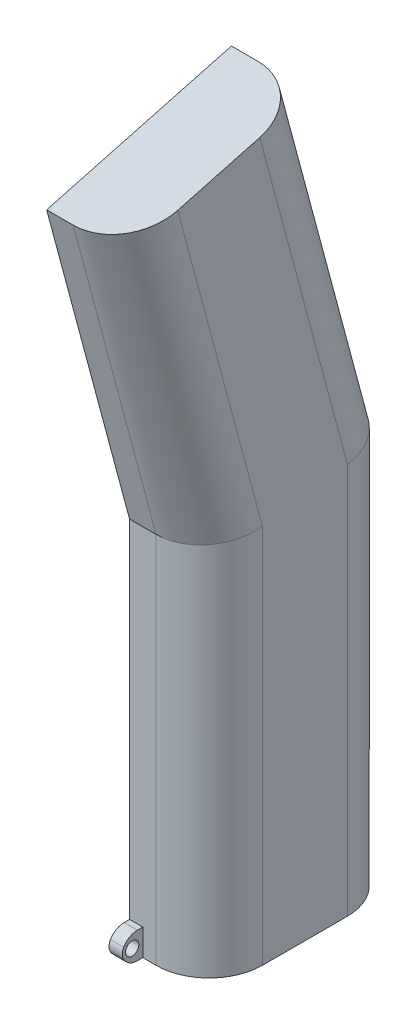
ISO-10303-21;
HEADER;
FILE_DESCRIPTION(('STEP AP214'),'2;1');
FILE_NAME('part.step','',(''),(''),'','','');
FILE_SCHEMA(('AUTOMOTIVE_DESIGN { 1 0 10303 214 1 1 1 1 }'));
ENDSEC;
DATA;
#1=APPLICATION_CONTEXT('core data for automotive mechanical design processes');
#2=APPLICATION_PROTOCOL_DEFINITION('international standard','automotive_design',2000,#1);
#3=PRODUCT_CONTEXT('',#1,'mechanical');
#4=PRODUCT('Part','Part','',(#3));
#5=PRODUCT_RELATED_PRODUCT_CATEGORY('part','',(#4));
#6=PRODUCT_DEFINITION_FORMATION('','',#4);
#7=PRODUCT_DEFINITION_CONTEXT('part definition',#1,'design');
#8=PRODUCT_DEFINITION('design','',#6,#7);
#9=PRODUCT_DEFINITION_SHAPE('','',#8);
#10=(LENGTH_UNIT() NAMED_UNIT(*) SI_UNIT(.MILLI.,.METRE.));
#11=(NAMED_UNIT(*) PLANE_ANGLE_UNIT() SI_UNIT($,.RADIAN.));
#12=(NAMED_UNIT(*) SI_UNIT($,.STERADIAN.) SOLID_ANGLE_UNIT());
#13=UNCERTAINTY_MEASURE_WITH_UNIT(LENGTH_MEASURE(1.E-05),#10,'distance_accuracy_value','');
#14=(GEOMETRIC_REPRESENTATION_CONTEXT(3) GLOBAL_UNCERTAINTY_ASSIGNED_CONTEXT((#13)) GLOBAL_UNIT_ASSIGNED_CONTEXT((#10,
#11,#12)) REPRESENTATION_CONTEXT('',''));
#15=CARTESIAN_POINT('',(0.,0.,0.));
#16=DIRECTION('',(0.,0.,1.));
#17=DIRECTION('',(1.,0.,0.));
#18=AXIS2_PLACEMENT_3D('',#15,#16,#17);
#19=CARTESIAN_POINT('',(15.,0.,18.));
#20=DIRECTION('',(0.,0.,-1.));
#21=DIRECTION('',(-1.,0.,0.));
#22=AXIS2_PLACEMENT_3D('',#19,#20,#21);
#23=PLANE('',#22);
#24=DIRECTION('',(0.,1.,0.));
#25=VECTOR('',#24,1.);
#26=CARTESIAN_POINT('',(2.5,0.,18.));
#27=LINE('',#26,#25);
#28=CARTESIAN_POINT('',(2.5,0.,18.));
#29=VERTEX_POINT('',#28);
#30=CARTESIAN_POINT('',(2.5,5.,18.));
#31=VERTEX_POINT('',#30);
#32=EDGE_CURVE('E234',#29,#31,#27,.T.);
#33=ORIENTED_EDGE('',*,*,#32,.F.);
#34=DIRECTION('',(-1.,0.,0.));
#35=VECTOR('',#34,1.);
#36=CARTESIAN_POINT('',(15.,0.,18.));
#37=LINE('',#36,#35);
#38=CARTESIAN_POINT('',(5.,0.,18.));
#39=VERTEX_POINT('',#38);
#40=EDGE_CURVE('E247',#39,#29,#37,.T.);
#41=ORIENTED_EDGE('',*,*,#40,.F.);
#42=DIRECTION('',(0.,-1.,0.));
#43=VECTOR('',#42,1.);
#44=CARTESIAN_POINT('',(5.,0.,18.));
#45=LINE('',#44,#43);
#46=CARTESIAN_POINT('',(5.,70.2605100868536,18.));
#47=VERTEX_POINT('',#46);
#48=EDGE_CURVE('E278',#39,#47,#45,.F.);
#49=ORIENTED_EDGE('',*,*,#48,.T.);
#50=DIRECTION('',(-1.,0.,0.));
#51=VECTOR('',#50,1.);
#52=CARTESIAN_POINT('',(15.,70.2605100868536,18.));
#53=LINE('',#52,#51);
#54=CARTESIAN_POINT('',(0.,70.2605100868536,18.));
#55=VERTEX_POINT('',#54);
#56=EDGE_CURVE('E453',#47,#55,#53,.T.);
#57=ORIENTED_EDGE('',*,*,#56,.T.);
#58=DIRECTION('',(0.,-1.,0.));
#59=VECTOR('',#58,1.);
#60=CARTESIAN_POINT('',(0.,0.,18.));
#61=LINE('',#60,#59);
#62=CARTESIAN_POINT('',(0.,5.,18.));
#63=VERTEX_POINT('',#62);
#64=EDGE_CURVE('E294',#55,#63,#61,.T.);
#65=ORIENTED_EDGE('',*,*,#64,.T.);
#66=DIRECTION('',(-1.,0.,0.));
#67=VECTOR('',#66,1.);
#68=CARTESIAN_POINT('',(0.,5.,18.));
#69=LINE('',#68,#67);
#70=EDGE_CURVE('E251',#31,#63,#69,.T.);
#71=ORIENTED_EDGE('',*,*,#70,.F.);
#72=EDGE_LOOP('',(#33,#41,#49,#57,#65,#71));
#73=FACE_BOUND('',#72,.T.);
#74=ADVANCED_FACE('F33',(#73),#23,.F.);
#75=CARTESIAN_POINT('',(0.,0.,0.));
#76=DIRECTION('',(-1.,0.,0.));
#77=DIRECTION('',(0.,0.,1.));
#78=AXIS2_PLACEMENT_3D('',#75,#76,#77);
#79=PLANE('',#78);
#80=CARTESIAN_POINT('',(0.,2.5,-20.));
#81=DIRECTION('',(-1.,0.,0.));
#82=DIRECTION('',(0.,0.,1.));
#83=AXIS2_PLACEMENT_3D('',#80,#81,#82);
#84=CIRCLE('',#83,1.25);
#85=CARTESIAN_POINT('',(0.,2.5,-18.75));
#86=VERTEX_POINT('',#85);
#87=EDGE_CURVE('E622',#86,#86,#84,.T.);
#88=ORIENTED_EDGE('',*,*,#87,.F.);
#89=EDGE_LOOP('',(#88));
#90=FACE_BOUND('',#89,.T.);
#91=CARTESIAN_POINT('',(0.,2.5,20.));
#92=DIRECTION('',(-1.,0.,0.));
#93=DIRECTION('',(0.,0.,1.));
#94=AXIS2_PLACEMENT_3D('',#91,#92,#93);
#95=CIRCLE('',#94,1.25);
#96=CARTESIAN_POINT('',(0.,2.5,21.25));
#97=VERTEX_POINT('',#96);
#98=EDGE_CURVE('E358',#97,#97,#95,.F.);
#99=ORIENTED_EDGE('',*,*,#98,.T.);
#100=EDGE_LOOP('',(#99));
#101=FACE_BOUND('',#100,.T.);
#102=CARTESIAN_POINT('',(0.,2.,-19.));
#103=DIRECTION('',(-1.,0.,0.));
#104=DIRECTION('',(0.,0.,1.));
#105=AXIS2_PLACEMENT_3D('',#102,#103,#104);
#106=CIRCLE('',#105,3.);
#107=CARTESIAN_POINT('',(0.,5.,-19.));
#108=VERTEX_POINT('',#107);
#109=CARTESIAN_POINT('',(0.,3.50000000000001,-21.5980762113533));
#110=VERTEX_POINT('',#109);
#111=EDGE_CURVE('E326',#108,#110,#106,.T.);
#112=ORIENTED_EDGE('',*,*,#111,.T.);
#113=CARTESIAN_POINT('',(0.,2.5,-19.8660254037844));
#114=DIRECTION('',(-1.,0.,0.));
#115=DIRECTION('',(0.,0.,1.));
#116=AXIS2_PLACEMENT_3D('',#113,#114,#115);
#117=CIRCLE('',#116,2.);
#118=CARTESIAN_POINT('',(0.,1.5,-21.5980762113533));
#119=VERTEX_POINT('',#118);
#120=EDGE_CURVE('E11',#110,#119,#117,.T.);
#121=ORIENTED_EDGE('',*,*,#120,.T.);
#122=CARTESIAN_POINT('',(0.,3.00000000000001,-19.));
#123=DIRECTION('',(-1.,0.,0.));
#124=DIRECTION('',(0.,0.,1.));
#125=AXIS2_PLACEMENT_3D('',#122,#123,#124);
#126=CIRCLE('',#125,3.);
#127=CARTESIAN_POINT('',(0.,0.,-19.));
#128=VERTEX_POINT('',#127);
#129=EDGE_CURVE('E328',#119,#128,#126,.T.);
#130=ORIENTED_EDGE('',*,*,#129,.T.);
#131=DIRECTION('',(0.,0.,-1.));
#132=VECTOR('',#131,1.);
#133=CARTESIAN_POINT('',(0.,0.,18.));
#134=LINE('',#133,#132);
#135=CARTESIAN_POINT('',(0.,0.,-3.1));
#136=VERTEX_POINT('',#135);
#137=EDGE_CURVE('E455',#136,#128,#134,.T.);
#138=ORIENTED_EDGE('',*,*,#137,.F.);
#139=DIRECTION('',(0.,-1.,0.));
#140=VECTOR('',#139,1.);
#141=CARTESIAN_POINT('',(0.,137.786178708789,-3.09999999999997));
#142=LINE('',#141,#140);
#143=CARTESIAN_POINT('',(0.,2.,-3.1));
#144=VERTEX_POINT('',#143);
#145=EDGE_CURVE('E371',#144,#136,#142,.T.);
#146=ORIENTED_EDGE('',*,*,#145,.F.);
#147=DIRECTION('',(0.,0.,-1.));
#148=VECTOR('',#147,1.);
#149=CARTESIAN_POINT('',(0.,2.,0.));
#150=LINE('',#149,#148);
#151=CARTESIAN_POINT('',(0.,2.00000000000001,-16.));
#152=VERTEX_POINT('',#151);
#153=EDGE_CURVE('E431',#144,#152,#150,.T.);
#154=ORIENTED_EDGE('',*,*,#153,.T.);
#155=DIRECTION('',(0.,1.,0.));
#156=VECTOR('',#155,1.);
#157=CARTESIAN_POINT('',(0.,0.,-16.));
#158=LINE('',#157,#156);
#159=CARTESIAN_POINT('',(0.,74.7366950048252,-16.));
#160=VERTEX_POINT('',#159);
#161=EDGE_CURVE('E440',#152,#160,#158,.T.);
#162=ORIENTED_EDGE('',*,*,#161,.T.);
#163=DIRECTION('',(0.,0.965925826289067,0.258819045102525));
#164=VECTOR('',#163,1.);
#165=CARTESIAN_POINT('',(0.,9.00640926787875,-33.6123769814821));
#166=LINE('',#165,#164);
#167=CARTESIAN_POINT('',(0.,135.335688966006,0.237451494037231));
#168=VERTEX_POINT('',#167);
#169=EDGE_CURVE('E437',#160,#168,#166,.T.);
#170=ORIENTED_EDGE('',*,*,#169,.T.);
#171=DIRECTION('',(0.,-0.258819045102526,0.965925826289067));
#172=VECTOR('',#171,1.);
#173=CARTESIAN_POINT('',(0.,126.329279698127,33.8498284755193));
#174=LINE('',#173,#172);
#175=CARTESIAN_POINT('',(0.,127.053479522725,31.1470779352874));
#176=VERTEX_POINT('',#175);
#177=EDGE_CURVE('E434',#168,#176,#174,.T.);
#178=ORIENTED_EDGE('',*,*,#177,.T.);
#179=DIRECTION('',(0.,-0.965925826289067,-0.258819045102525));
#180=VECTOR('',#179,1.);
#181=CARTESIAN_POINT('',(0.,0.724199824597937,-2.70275054023192));
#182=LINE('',#181,#180);
#183=CARTESIAN_POINT('',(0.,70.5238150820284,16.));
#184=VERTEX_POINT('',#183);
#185=EDGE_CURVE('E393',#176,#184,#182,.T.);
#186=ORIENTED_EDGE('',*,*,#185,.T.);
#187=DIRECTION('',(0.,-1.,0.));
#188=VECTOR('',#187,1.);
#189=CARTESIAN_POINT('',(0.,0.,16.));
#190=LINE('',#189,#188);
#191=CARTESIAN_POINT('',(0.,2.,16.));
#192=VERTEX_POINT('',#191);
#193=EDGE_CURVE('E418',#184,#192,#190,.T.);
#194=ORIENTED_EDGE('',*,*,#193,.T.);
#195=CARTESIAN_POINT('',(0.,2.,3.1));
#196=VERTEX_POINT('',#195);
#197=EDGE_CURVE('E443',#192,#196,#150,.T.);
#198=ORIENTED_EDGE('',*,*,#197,.T.);
#199=DIRECTION('',(0.,-1.,0.));
#200=VECTOR('',#199,1.);
#201=CARTESIAN_POINT('',(0.,137.786178708789,3.10000000000003));
#202=LINE('',#201,#200);
#203=CARTESIAN_POINT('',(0.,0.,3.1));
#204=VERTEX_POINT('',#203);
#205=EDGE_CURVE('E374',#196,#204,#202,.T.);
#206=ORIENTED_EDGE('',*,*,#205,.T.);
#207=CARTESIAN_POINT('',(0.,0.,19.));
#208=VERTEX_POINT('',#207);
#209=EDGE_CURVE('E456',#208,#204,#134,.T.);
#210=ORIENTED_EDGE('',*,*,#209,.F.);
#211=CARTESIAN_POINT('',(0.,3.,19.));
#212=DIRECTION('',(-1.,0.,0.));
#213=DIRECTION('',(0.,0.,1.));
#214=AXIS2_PLACEMENT_3D('',#211,#212,#213);
#215=CIRCLE('',#214,3.);
#216=CARTESIAN_POINT('',(0.,1.5,21.5980762113533));
#217=VERTEX_POINT('',#216);
#218=EDGE_CURVE('E305',#208,#217,#215,.T.);
#219=ORIENTED_EDGE('',*,*,#218,.T.);
#220=CARTESIAN_POINT('',(0.,2.5,19.8660254037844));
#221=DIRECTION('',(-1.,0.,0.));
#222=DIRECTION('',(0.,0.,1.));
#223=AXIS2_PLACEMENT_3D('',#220,#221,#222);
#224=CIRCLE('',#223,2.);
#225=CARTESIAN_POINT('',(0.,3.5,21.5980762113533));
#226=VERTEX_POINT('',#225);
#227=EDGE_CURVE('E313',#217,#226,#224,.T.);
#228=ORIENTED_EDGE('',*,*,#227,.T.);
#229=CARTESIAN_POINT('',(0.,2.,19.));
#230=DIRECTION('',(-1.,0.,0.));
#231=DIRECTION('',(0.,0.,1.));
#232=AXIS2_PLACEMENT_3D('',#229,#230,#231);
#233=CIRCLE('',#232,3.);
#234=CARTESIAN_POINT('',(0.,5.,19.));
#235=VERTEX_POINT('',#234);
#236=EDGE_CURVE('E303',#226,#235,#233,.T.);
#237=ORIENTED_EDGE('',*,*,#236,.T.);
#238=DIRECTION('',(0.,0.,-1.));
#239=VECTOR('',#238,1.);
#240=CARTESIAN_POINT('',(0.,5.,22.));
#241=LINE('',#240,#239);
#242=EDGE_CURVE('E364',#235,#63,#241,.T.);
#243=ORIENTED_EDGE('',*,*,#242,.T.);
#244=ORIENTED_EDGE('',*,*,#64,.F.);
#245=DIRECTION('',(0.,-0.965925826289067,-0.258819045102525));
#246=VECTOR('',#245,1.);
#247=CARTESIAN_POINT('',(0.,70.2605100868536,18.));
#248=LINE('',#247,#246);
#249=CARTESIAN_POINT('',(0.,128.467693085098,33.5965676780706));
#250=VERTEX_POINT('',#249);
#251=EDGE_CURVE('E450',#250,#55,#248,.T.);
#252=ORIENTED_EDGE('',*,*,#251,.F.);
#253=DIRECTION('',(0.,-0.258819045102526,0.965925826289067));
#254=VECTOR('',#253,1.);
#255=CARTESIAN_POINT('',(0.,137.785178708789,-1.17676206833585));
#256=LINE('',#255,#254);
#257=CARTESIAN_POINT('',(0.,137.785178708789,-1.17676206833585));
#258=VERTEX_POINT('',#257);
#259=EDGE_CURVE('E463',#258,#250,#256,.T.);
#260=ORIENTED_EDGE('',*,*,#259,.F.);
#261=DIRECTION('',(0.,0.965925826289067,0.258819045102525));
#262=VECTOR('',#261,1.);
#263=CARTESIAN_POINT('',(0.,75.,-18.));
#264=LINE('',#263,#262);
#265=CARTESIAN_POINT('',(0.,75.,-18.));
#266=VERTEX_POINT('',#265);
#267=EDGE_CURVE('E460',#266,#258,#264,.T.);
#268=ORIENTED_EDGE('',*,*,#267,.F.);
#269=DIRECTION('',(0.,1.,0.));
#270=VECTOR('',#269,1.);
#271=CARTESIAN_POINT('',(0.,0.,-18.));
#272=LINE('',#271,#270);
#273=CARTESIAN_POINT('',(0.,5.,-18.));
#274=VERTEX_POINT('',#273);
#275=EDGE_CURVE('E458',#274,#266,#272,.T.);
#276=ORIENTED_EDGE('',*,*,#275,.F.);
#277=DIRECTION('',(0.,0.,1.));
#278=VECTOR('',#277,1.);
#279=CARTESIAN_POINT('',(0.,5.,-22.));
#280=LINE('',#279,#278);
#281=EDGE_CURVE('E351',#108,#274,#280,.T.);
#282=ORIENTED_EDGE('',*,*,#281,.F.);
#283=EDGE_LOOP('',(#112,#121,#130,#138,#146,#154,#162,#170,#178,#186,#194,#198,#206,#210,#219,
#228,#237,#243,#244,#252,#260,#268,#276,#282));
#284=FACE_BOUND('',#283,.T.);
#285=ADVANCED_FACE('F484',(#90,#101,#284),#79,.T.);
#286=CARTESIAN_POINT('',(15.,0.,18.));
#287=DIRECTION('',(0.,1.,0.));
#288=DIRECTION('',(0.,0.,1.));
#289=AXIS2_PLACEMENT_3D('',#286,#287,#288);
#290=PLANE('',#289);
#291=ORIENTED_EDGE('',*,*,#137,.T.);
#292=DIRECTION('',(1.,0.,0.));
#293=VECTOR('',#292,1.);
#294=CARTESIAN_POINT('',(15.,0.,-19.));
#295=LINE('',#294,#293);
#296=CARTESIAN_POINT('',(2.5,0.,-19.));
#297=VERTEX_POINT('',#296);
#298=EDGE_CURVE('E319',#128,#297,#295,.T.);
#299=ORIENTED_EDGE('',*,*,#298,.T.);
#300=DIRECTION('',(0.,0.,1.));
#301=VECTOR('',#300,1.);
#302=CARTESIAN_POINT('',(2.5,0.,-22.));
#303=LINE('',#302,#301);
#304=CARTESIAN_POINT('',(2.5,0.,-18.));
#305=VERTEX_POINT('',#304);
#306=EDGE_CURVE('E345',#297,#305,#303,.T.);
#307=ORIENTED_EDGE('',*,*,#306,.T.);
#308=DIRECTION('',(-1.,0.,0.));
#309=VECTOR('',#308,1.);
#310=CARTESIAN_POINT('',(15.,0.,-18.));
#311=LINE('',#310,#309);
#312=CARTESIAN_POINT('',(5.,0.,-18.));
#313=VERTEX_POINT('',#312);
#314=EDGE_CURVE('E259',#313,#305,#311,.T.);
#315=ORIENTED_EDGE('',*,*,#314,.F.);
#316=CARTESIAN_POINT('',(5.,0.,-8.));
#317=DIRECTION('',(0.,1.,0.));
#318=DIRECTION('',(0.,0.,1.));
#319=AXIS2_PLACEMENT_3D('',#316,#317,#318);
#320=CIRCLE('',#319,10.);
#321=CARTESIAN_POINT('',(15.,0.,-8.));
#322=VERTEX_POINT('',#321);
#323=EDGE_CURVE('E275',#313,#322,#320,.F.);
#324=ORIENTED_EDGE('',*,*,#323,.T.);
#325=DIRECTION('',(0.,0.,-1.));
#326=VECTOR('',#325,1.);
#327=CARTESIAN_POINT('',(15.,0.,18.));
#328=LINE('',#327,#326);
#329=CARTESIAN_POINT('',(15.,0.,8.));
#330=VERTEX_POINT('',#329);
#331=EDGE_CURVE('E446',#330,#322,#328,.T.);
#332=ORIENTED_EDGE('',*,*,#331,.F.);
#333=CARTESIAN_POINT('',(5.,0.,8.));
#334=DIRECTION('',(0.,1.,0.));
#335=DIRECTION('',(0.,0.,1.));
#336=AXIS2_PLACEMENT_3D('',#333,#334,#335);
#337=CIRCLE('',#336,10.);
#338=EDGE_CURVE('E257',#330,#39,#337,.F.);
#339=ORIENTED_EDGE('',*,*,#338,.T.);
#340=ORIENTED_EDGE('',*,*,#40,.T.);
#341=DIRECTION('',(0.,0.,-1.));
#342=VECTOR('',#341,1.);
#343=CARTESIAN_POINT('',(2.5,0.,22.));
#344=LINE('',#343,#342);
#345=CARTESIAN_POINT('',(2.5,0.,19.));
#346=VERTEX_POINT('',#345);
#347=EDGE_CURVE('E229',#346,#29,#344,.T.);
#348=ORIENTED_EDGE('',*,*,#347,.F.);
#349=DIRECTION('',(1.,0.,0.));
#350=VECTOR('',#349,1.);
#351=CARTESIAN_POINT('',(15.,0.,19.));
#352=LINE('',#351,#350);
#353=EDGE_CURVE('E301',#346,#208,#352,.F.);
#354=ORIENTED_EDGE('',*,*,#353,.T.);
#355=ORIENTED_EDGE('',*,*,#209,.T.);
#356=CARTESIAN_POINT('',(0.,0.,0.));
#357=DIRECTION('',(0.,-1.,0.));
#358=DIRECTION('',(0.,0.,-1.));
#359=AXIS2_PLACEMENT_3D('',#356,#357,#358);
#360=CIRCLE('',#359,3.1);
#361=EDGE_CURVE('E367',#136,#204,#360,.T.);
#362=ORIENTED_EDGE('',*,*,#361,.F.);
#363=EDGE_LOOP('',(#291,#299,#307,#315,#324,#332,#339,#340,#348,#354,#355,#362));
#364=FACE_BOUND('',#363,.T.);
#365=ADVANCED_FACE('F255',(#364),#290,.F.);
#366=CARTESIAN_POINT('',(15.,0.,-18.));
#367=DIRECTION('',(0.,0.,1.));
#368=DIRECTION('',(1.,0.,0.));
#369=AXIS2_PLACEMENT_3D('',#366,#367,#368);
#370=PLANE('',#369);
#371=DIRECTION('',(0.,1.,0.));
#372=VECTOR('',#371,1.);
#373=CARTESIAN_POINT('',(2.5,0.,-18.));
#374=LINE('',#373,#372);
#375=CARTESIAN_POINT('',(2.5,5.,-18.));
#376=VERTEX_POINT('',#375);
#377=EDGE_CURVE('E347',#305,#376,#374,.T.);
#378=ORIENTED_EDGE('',*,*,#377,.T.);
#379=DIRECTION('',(-1.,0.,0.));
#380=VECTOR('',#379,1.);
#381=CARTESIAN_POINT('',(0.,5.,-18.));
#382=LINE('',#381,#380);
#383=EDGE_CURVE('E353',#376,#274,#382,.T.);
#384=ORIENTED_EDGE('',*,*,#383,.T.);
#385=ORIENTED_EDGE('',*,*,#275,.T.);
#386=DIRECTION('',(-1.,0.,0.));
#387=VECTOR('',#386,1.);
#388=CARTESIAN_POINT('',(15.,75.,-18.));
#389=LINE('',#388,#387);
#390=CARTESIAN_POINT('',(5.,75.,-18.));
#391=VERTEX_POINT('',#390);
#392=EDGE_CURVE('E264',#391,#266,#389,.T.);
#393=ORIENTED_EDGE('',*,*,#392,.F.);
#394=DIRECTION('',(0.,1.,0.));
#395=VECTOR('',#394,1.);
#396=CARTESIAN_POINT('',(5.,0.,-18.));
#397=LINE('',#396,#395);
#398=EDGE_CURVE('E288',#391,#313,#397,.F.);
#399=ORIENTED_EDGE('',*,*,#398,.T.);
#400=ORIENTED_EDGE('',*,*,#314,.T.);
#401=EDGE_LOOP('',(#378,#384,#385,#393,#399,#400));
#402=FACE_BOUND('',#401,.T.);
#403=ADVANCED_FACE('F501',(#402),#370,.F.);
#404=CARTESIAN_POINT('',(15.,75.,-18.));
#405=DIRECTION('',(0.,-0.258819045102525,0.965925826289067));
#406=DIRECTION('',(0.,-0.965925826289067,-0.258819045102525));
#407=AXIS2_PLACEMENT_3D('',#404,#405,#406);
#408=PLANE('',#407);
#409=DIRECTION('',(-1.,0.,0.));
#410=VECTOR('',#409,1.);
#411=CARTESIAN_POINT('',(15.,137.785178708789,-1.17676206833585));
#412=LINE('',#411,#410);
#413=CARTESIAN_POINT('',(5.,137.785178708789,-1.17676206833585));
#414=VERTEX_POINT('',#413);
#415=EDGE_CURVE('E471',#414,#258,#412,.T.);
#416=ORIENTED_EDGE('',*,*,#415,.F.);
#417=DIRECTION('',(0.,0.965925826289067,0.258819045102525));
#418=VECTOR('',#417,1.);
#419=CARTESIAN_POINT('',(5.,75.,-18.));
#420=LINE('',#419,#418);
#421=EDGE_CURVE('E286',#414,#391,#420,.F.);
#422=ORIENTED_EDGE('',*,*,#421,.T.);
#423=ORIENTED_EDGE('',*,*,#392,.T.);
#424=ORIENTED_EDGE('',*,*,#267,.T.);
#425=EDGE_LOOP('',(#416,#422,#423,#424));
#426=FACE_BOUND('',#425,.T.);
#427=ADVANCED_FACE('F477',(#426),#408,.F.);
#428=CARTESIAN_POINT('',(15.,137.785178708789,-1.17676206833585));
#429=DIRECTION('',(0.,-0.965925826289067,-0.258819045102526));
#430=DIRECTION('',(0.,0.258819045102526,-0.965925826289067));
#431=AXIS2_PLACEMENT_3D('',#428,#429,#430);
#432=PLANE('',#431);
#433=DIRECTION('',(-1.,0.,0.));
#434=VECTOR('',#433,1.);
#435=CARTESIAN_POINT('',(15.,128.467693085098,33.5965676780706));
#436=LINE('',#435,#434);
#437=CARTESIAN_POINT('',(5.,128.467693085098,33.5965676780706));
#438=VERTEX_POINT('',#437);
#439=EDGE_CURVE('E469',#438,#250,#436,.T.);
#440=ORIENTED_EDGE('',*,*,#439,.F.);
#441=CARTESIAN_POINT('',(5.,131.055883536124,23.9373094151799));
#442=DIRECTION('',(0.,-0.965925826289067,-0.258819045102526));
#443=DIRECTION('',(0.,0.258819045102526,-0.965925826289067));
#444=AXIS2_PLACEMENT_3D('',#441,#442,#443);
#445=CIRCLE('',#444,10.);
#446=CARTESIAN_POINT('',(15.,131.055883536124,23.9373094151799));
#447=VERTEX_POINT('',#446);
#448=EDGE_CURVE('E284',#438,#447,#445,.F.);
#449=ORIENTED_EDGE('',*,*,#448,.T.);
#450=DIRECTION('',(0.,-0.258819045102526,0.965925826289067));
#451=VECTOR('',#450,1.);
#452=CARTESIAN_POINT('',(15.,137.785178708789,-1.17676206833585));
#453=LINE('',#452,#451);
#454=CARTESIAN_POINT('',(15.,135.196988257764,8.48249619455482));
#455=VERTEX_POINT('',#454);
#456=EDGE_CURVE('E449',#455,#447,#453,.T.);
#457=ORIENTED_EDGE('',*,*,#456,.F.);
#458=CARTESIAN_POINT('',(5.,135.196988257764,8.48249619455483));
#459=DIRECTION('',(0.,-0.965925826289067,-0.258819045102526));
#460=DIRECTION('',(0.,0.258819045102526,-0.965925826289067));
#461=AXIS2_PLACEMENT_3D('',#458,#459,#460);
#462=CIRCLE('',#461,10.);
#463=EDGE_CURVE('E282',#455,#414,#462,.F.);
#464=ORIENTED_EDGE('',*,*,#463,.T.);
#465=ORIENTED_EDGE('',*,*,#415,.T.);
#466=ORIENTED_EDGE('',*,*,#259,.T.);
#467=EDGE_LOOP('',(#440,#449,#457,#464,#465,#466));
#468=FACE_BOUND('',#467,.T.);
#469=ADVANCED_FACE('F490',(#468),#432,.F.);
#470=CARTESIAN_POINT('',(15.,70.2605100868536,18.));
#471=DIRECTION('',(0.,0.258819045102525,-0.965925826289067));
#472=DIRECTION('',(0.,0.965925826289067,0.258819045102525));
#473=AXIS2_PLACEMENT_3D('',#470,#471,#472);
#474=PLANE('',#473);
#475=ORIENTED_EDGE('',*,*,#56,.F.);
#476=DIRECTION('',(0.,-0.965925826289067,-0.258819045102525));
#477=VECTOR('',#476,1.);
#478=CARTESIAN_POINT('',(5.,70.2605100868536,18.));
#479=LINE('',#478,#477);
#480=EDGE_CURVE('E280',#47,#438,#479,.F.);
#481=ORIENTED_EDGE('',*,*,#480,.T.);
#482=ORIENTED_EDGE('',*,*,#439,.T.);
#483=ORIENTED_EDGE('',*,*,#251,.T.);
#484=EDGE_LOOP('',(#475,#481,#482,#483));
#485=FACE_BOUND('',#484,.T.);
#486=ADVANCED_FACE('F512',(#485),#474,.F.);
#487=CARTESIAN_POINT('',(15.,0.,0.));
#488=DIRECTION('',(-1.,0.,0.));
#489=DIRECTION('',(0.,0.,1.));
#490=AXIS2_PLACEMENT_3D('',#487,#488,#489);
#491=PLANE('',#490);
#492=DIRECTION('',(0.,-0.965925826289067,-0.258819045102525));
#493=VECTOR('',#492,1.);
#494=CARTESIAN_POINT('',(15.,2.79475218541814,-10.4301571505445));
#495=LINE('',#494,#493);
#496=CARTESIAN_POINT('',(15.,71.5770350627276,8.));
#497=VERTEX_POINT('',#496);
#498=EDGE_CURVE('E270',#447,#497,#495,.T.);
#499=ORIENTED_EDGE('',*,*,#498,.T.);
#500=DIRECTION('',(0.,-1.,0.));
#501=VECTOR('',#500,1.);
#502=CARTESIAN_POINT('',(15.,0.,8.));
#503=LINE('',#502,#501);
#504=EDGE_CURVE('E272',#497,#330,#503,.T.);
#505=ORIENTED_EDGE('',*,*,#504,.T.);
#506=ORIENTED_EDGE('',*,*,#331,.T.);
#507=DIRECTION('',(0.,1.,0.));
#508=VECTOR('',#507,1.);
#509=CARTESIAN_POINT('',(15.,0.,-8.));
#510=LINE('',#509,#508);
#511=CARTESIAN_POINT('',(15.,73.683475024126,-8.));
#512=VERTEX_POINT('',#511);
#513=EDGE_CURVE('E258',#322,#512,#510,.T.);
#514=ORIENTED_EDGE('',*,*,#513,.T.);
#515=DIRECTION('',(0.,0.965925826289067,0.258819045102525));
#516=VECTOR('',#515,1.);
#517=CARTESIAN_POINT('',(15.,6.93585690705854,-25.8849703711695));
#518=LINE('',#517,#516);
#519=EDGE_CURVE('E261',#512,#455,#518,.T.);
#520=ORIENTED_EDGE('',*,*,#519,.T.);
#521=ORIENTED_EDGE('',*,*,#456,.T.);
#522=EDGE_LOOP('',(#499,#505,#506,#514,#520,#521));
#523=FACE_BOUND('',#522,.T.);
#524=ADVANCED_FACE('F503',(#523),#491,.F.);
#525=CARTESIAN_POINT('',(5.,2.79475218541814,-10.4301571505445));
#526=DIRECTION('',(0.,-0.965925826289067,-0.258819045102525));
#527=DIRECTION('',(0.,0.258819045102525,-0.965925826289067));
#528=AXIS2_PLACEMENT_3D('',#525,#526,#527);
#529=CYLINDRICAL_SURFACE('',#528,10.);
#530=ORIENTED_EDGE('',*,*,#448,.F.);
#531=ORIENTED_EDGE('',*,*,#480,.F.);
#532=CARTESIAN_POINT('',(5.,71.5770350627276,8.));
#533=DIRECTION('',(0.,-0.99144486137381,-0.130526192220054));
#534=DIRECTION('',(0.,-0.130526192220054,0.99144486137381));
#535=AXIS2_PLACEMENT_3D('',#532,#533,#534);
#536=ELLIPSE('',#535,10.0862896058015,10.);
#537=EDGE_CURVE('E291',#497,#47,#536,.T.);
#538=ORIENTED_EDGE('',*,*,#537,.F.);
#539=ORIENTED_EDGE('',*,*,#498,.F.);
#540=EDGE_LOOP('',(#530,#531,#538,#539));
#541=FACE_BOUND('',#540,.T.);
#542=ADVANCED_FACE('F514',(#541),#529,.T.);
#543=CARTESIAN_POINT('',(5.,0.,8.));
#544=DIRECTION('',(0.,-1.,0.));
#545=DIRECTION('',(0.,0.,-1.));
#546=AXIS2_PLACEMENT_3D('',#543,#544,#545);
#547=CYLINDRICAL_SURFACE('',#546,10.);
#548=ORIENTED_EDGE('',*,*,#537,.T.);
#549=ORIENTED_EDGE('',*,*,#48,.F.);
#550=ORIENTED_EDGE('',*,*,#338,.F.);
#551=ORIENTED_EDGE('',*,*,#504,.F.);
#552=EDGE_LOOP('',(#548,#549,#550,#551));
#553=FACE_BOUND('',#552,.T.);
#554=ADVANCED_FACE('F508',(#553),#547,.T.);
#555=CARTESIAN_POINT('',(5.,0.,-8.));
#556=DIRECTION('',(0.,1.,0.));
#557=DIRECTION('',(0.,0.,1.));
#558=AXIS2_PLACEMENT_3D('',#555,#556,#557);
#559=CYLINDRICAL_SURFACE('',#558,10.);
#560=ORIENTED_EDGE('',*,*,#323,.F.);
#561=ORIENTED_EDGE('',*,*,#398,.F.);
#562=CARTESIAN_POINT('',(5.,73.683475024126,-8.));
#563=DIRECTION('',(0.,0.99144486137381,0.130526192220054));
#564=DIRECTION('',(0.,0.130526192220054,-0.99144486137381));
#565=AXIS2_PLACEMENT_3D('',#562,#563,#564);
#566=ELLIPSE('',#565,10.0862896058015,10.);
#567=EDGE_CURVE('E295',#512,#391,#566,.T.);
#568=ORIENTED_EDGE('',*,*,#567,.F.);
#569=ORIENTED_EDGE('',*,*,#513,.F.);
#570=EDGE_LOOP('',(#560,#561,#568,#569));
#571=FACE_BOUND('',#570,.T.);
#572=ADVANCED_FACE('F500',(#571),#559,.T.);
#573=CARTESIAN_POINT('',(5.,6.93585690705855,-25.8849703711695));
#574=DIRECTION('',(0.,0.965925826289067,0.258819045102525));
#575=DIRECTION('',(0.,-0.258819045102525,0.965925826289067));
#576=AXIS2_PLACEMENT_3D('',#573,#574,#575);
#577=CYLINDRICAL_SURFACE('',#576,10.);
#578=ORIENTED_EDGE('',*,*,#567,.T.);
#579=ORIENTED_EDGE('',*,*,#421,.F.);
#580=ORIENTED_EDGE('',*,*,#463,.F.);
#581=ORIENTED_EDGE('',*,*,#519,.F.);
#582=EDGE_LOOP('',(#578,#579,#580,#581));
#583=FACE_BOUND('',#582,.T.);
#584=ADVANCED_FACE('F494',(#583),#577,.T.);
#585=CARTESIAN_POINT('',(15.,0.,16.));
#586=DIRECTION('',(0.,0.,-1.));
#587=DIRECTION('',(-1.,0.,0.));
#588=AXIS2_PLACEMENT_3D('',#585,#586,#587);
#589=PLANE('',#588);
#590=DIRECTION('',(-1.,0.,0.));
#591=VECTOR('',#590,1.);
#592=CARTESIAN_POINT('',(15.,2.,16.));
#593=LINE('',#592,#591);
#594=CARTESIAN_POINT('',(5.,2.,16.));
#595=VERTEX_POINT('',#594);
#596=EDGE_CURVE('E378',#595,#192,#593,.T.);
#597=ORIENTED_EDGE('',*,*,#596,.T.);
#598=ORIENTED_EDGE('',*,*,#193,.F.);
#599=DIRECTION('',(-1.,0.,0.));
#600=VECTOR('',#599,1.);
#601=CARTESIAN_POINT('',(15.,70.5238150820284,16.));
#602=LINE('',#601,#600);
#603=CARTESIAN_POINT('',(5.,70.5238150820284,16.));
#604=VERTEX_POINT('',#603);
#605=EDGE_CURVE('E386',#604,#184,#602,.T.);
#606=ORIENTED_EDGE('',*,*,#605,.F.);
#607=DIRECTION('',(0.,1.,0.));
#608=VECTOR('',#607,1.);
#609=CARTESIAN_POINT('',(5.,0.,16.));
#610=LINE('',#609,#608);
#611=EDGE_CURVE('E382',#595,#604,#610,.T.);
#612=ORIENTED_EDGE('',*,*,#611,.F.);
#613=EDGE_LOOP('',(#597,#598,#606,#612));
#614=FACE_BOUND('',#613,.T.);
#615=ADVANCED_FACE('F584',(#614),#589,.T.);
#616=CARTESIAN_POINT('',(15.,2.,18.));
#617=DIRECTION('',(0.,1.,0.));
#618=DIRECTION('',(0.,0.,1.));
#619=AXIS2_PLACEMENT_3D('',#616,#617,#618);
#620=PLANE('',#619);
#621=CARTESIAN_POINT('',(0.,2.,0.));
#622=DIRECTION('',(0.,1.,0.));
#623=DIRECTION('',(0.,0.,1.));
#624=AXIS2_PLACEMENT_3D('',#621,#622,#623);
#625=CIRCLE('',#624,3.1);
#626=EDGE_CURVE('E242',#144,#196,#625,.F.);
#627=ORIENTED_EDGE('',*,*,#626,.T.);
#628=ORIENTED_EDGE('',*,*,#197,.F.);
#629=ORIENTED_EDGE('',*,*,#596,.F.);
#630=CARTESIAN_POINT('',(5.,2.,8.));
#631=DIRECTION('',(0.,1.,0.));
#632=DIRECTION('',(0.,0.,1.));
#633=AXIS2_PLACEMENT_3D('',#630,#631,#632);
#634=CIRCLE('',#633,8.);
#635=CARTESIAN_POINT('',(13.,2.,8.));
#636=VERTEX_POINT('',#635);
#637=EDGE_CURVE('E385',#636,#595,#634,.F.);
#638=ORIENTED_EDGE('',*,*,#637,.F.);
#639=DIRECTION('',(0.,0.,-1.));
#640=VECTOR('',#639,1.);
#641=CARTESIAN_POINT('',(13.,2.,0.));
#642=LINE('',#641,#640);
#643=CARTESIAN_POINT('',(13.,2.00000000000001,-8.));
#644=VERTEX_POINT('',#643);
#645=EDGE_CURVE('E390',#636,#644,#642,.T.);
#646=ORIENTED_EDGE('',*,*,#645,.T.);
#647=CARTESIAN_POINT('',(5.,2.00000000000001,-8.));
#648=DIRECTION('',(0.,1.,0.));
#649=DIRECTION('',(0.,0.,1.));
#650=AXIS2_PLACEMENT_3D('',#647,#648,#649);
#651=CIRCLE('',#650,8.);
#652=CARTESIAN_POINT('',(5.,2.00000000000001,-16.));
#653=VERTEX_POINT('',#652);
#654=EDGE_CURVE('E395',#653,#644,#651,.F.);
#655=ORIENTED_EDGE('',*,*,#654,.F.);
#656=DIRECTION('',(-1.,0.,0.));
#657=VECTOR('',#656,1.);
#658=CARTESIAN_POINT('',(15.,2.00000000000001,-16.));
#659=LINE('',#658,#657);
#660=EDGE_CURVE('E381',#653,#152,#659,.T.);
#661=ORIENTED_EDGE('',*,*,#660,.T.);
#662=ORIENTED_EDGE('',*,*,#153,.F.);
#663=EDGE_LOOP('',(#627,#628,#629,#638,#646,#655,#661,#662));
#664=FACE_BOUND('',#663,.T.);
#665=ADVANCED_FACE('F580',(#664),#620,.T.);
#666=CARTESIAN_POINT('',(15.,0.,-16.));
#667=DIRECTION('',(0.,0.,1.));
#668=DIRECTION('',(1.,0.,0.));
#669=AXIS2_PLACEMENT_3D('',#666,#667,#668);
#670=PLANE('',#669);
#671=DIRECTION('',(-1.,0.,0.));
#672=VECTOR('',#671,1.);
#673=CARTESIAN_POINT('',(15.,74.7366950048252,-16.));
#674=LINE('',#673,#672);
#675=CARTESIAN_POINT('',(5.,74.7366950048252,-16.));
#676=VERTEX_POINT('',#675);
#677=EDGE_CURVE('E398',#676,#160,#674,.T.);
#678=ORIENTED_EDGE('',*,*,#677,.T.);
#679=ORIENTED_EDGE('',*,*,#161,.F.);
#680=ORIENTED_EDGE('',*,*,#660,.F.);
#681=DIRECTION('',(0.,1.,0.));
#682=VECTOR('',#681,1.);
#683=CARTESIAN_POINT('',(5.,0.,-16.));
#684=LINE('',#683,#682);
#685=EDGE_CURVE('E298',#676,#653,#684,.F.);
#686=ORIENTED_EDGE('',*,*,#685,.F.);
#687=EDGE_LOOP('',(#678,#679,#680,#686));
#688=FACE_BOUND('',#687,.T.);
#689=ADVANCED_FACE('F576',(#688),#670,.T.);
#690=CARTESIAN_POINT('',(15.,74.4823619097949,-16.0681483474219));
#691=DIRECTION('',(0.,-0.258819045102525,0.965925826289067));
#692=DIRECTION('',(0.,-0.965925826289067,-0.258819045102525));
#693=AXIS2_PLACEMENT_3D('',#690,#691,#692);
#694=PLANE('',#693);
#695=DIRECTION('',(-1.,0.,0.));
#696=VECTOR('',#695,1.);
#697=CARTESIAN_POINT('',(15.,135.335688966006,0.237451494037229));
#698=LINE('',#697,#696);
#699=CARTESIAN_POINT('',(5.,135.335688966006,0.237451494037234));
#700=VERTEX_POINT('',#699);
#701=EDGE_CURVE('E402',#700,#168,#698,.T.);
#702=ORIENTED_EDGE('',*,*,#701,.T.);
#703=ORIENTED_EDGE('',*,*,#169,.F.);
#704=ORIENTED_EDGE('',*,*,#677,.F.);
#705=DIRECTION('',(0.,-0.965925826289067,-0.258819045102525));
#706=VECTOR('',#705,1.);
#707=CARTESIAN_POINT('',(5.,74.4823619097949,-16.0681483474219));
#708=LINE('',#707,#706);
#709=EDGE_CURVE('E404',#700,#676,#708,.T.);
#710=ORIENTED_EDGE('',*,*,#709,.F.);
#711=EDGE_LOOP('',(#702,#703,#704,#710));
#712=FACE_BOUND('',#711,.T.);
#713=ADVANCED_FACE('F572',(#712),#694,.T.);
#714=CARTESIAN_POINT('',(15.,135.853327056211,-1.6944001585409));
#715=DIRECTION('',(0.,-0.965925826289067,-0.258819045102526));
#716=DIRECTION('',(0.,0.258819045102526,-0.965925826289067));
#717=AXIS2_PLACEMENT_3D('',#714,#715,#716);
#718=PLANE('',#717);
#719=DIRECTION('',(-1.,0.,0.));
#720=VECTOR('',#719,1.);
#721=CARTESIAN_POINT('',(15.,127.053479522725,31.1470779352874));
#722=LINE('',#721,#720);
#723=CARTESIAN_POINT('',(5.,127.053479522725,31.1470779352874));
#724=VERTEX_POINT('',#723);
#725=EDGE_CURVE('E388',#724,#176,#722,.T.);
#726=ORIENTED_EDGE('',*,*,#725,.T.);
#727=ORIENTED_EDGE('',*,*,#177,.F.);
#728=ORIENTED_EDGE('',*,*,#701,.F.);
#729=CARTESIAN_POINT('',(5.,133.265136605186,7.96485810434977));
#730=DIRECTION('',(0.,-0.965925826289067,-0.258819045102526));
#731=DIRECTION('',(0.,0.258819045102526,-0.965925826289067));
#732=AXIS2_PLACEMENT_3D('',#729,#730,#731);
#733=CIRCLE('',#732,8.);
#734=CARTESIAN_POINT('',(13.,133.265136605186,7.96485810434978));
#735=VERTEX_POINT('',#734);
#736=EDGE_CURVE('E410',#735,#700,#733,.F.);
#737=ORIENTED_EDGE('',*,*,#736,.F.);
#738=DIRECTION('',(0.,-0.258819045102526,0.965925826289067));
#739=VECTOR('',#738,1.);
#740=CARTESIAN_POINT('',(13.,126.329279698127,33.8498284755193));
#741=LINE('',#740,#739);
#742=CARTESIAN_POINT('',(13.,129.124031883546,23.4196713249749));
#743=VERTEX_POINT('',#742);
#744=EDGE_CURVE('E389',#735,#743,#741,.T.);
#745=ORIENTED_EDGE('',*,*,#744,.T.);
#746=CARTESIAN_POINT('',(5.,129.124031883546,23.4196713249749));
#747=DIRECTION('',(0.,-0.965925826289067,-0.258819045102526));
#748=DIRECTION('',(0.,0.258819045102526,-0.965925826289067));
#749=AXIS2_PLACEMENT_3D('',#746,#747,#748);
#750=CIRCLE('',#749,8.);
#751=EDGE_CURVE('E407',#724,#743,#750,.F.);
#752=ORIENTED_EDGE('',*,*,#751,.F.);
#753=EDGE_LOOP('',(#726,#727,#728,#737,#745,#752));
#754=FACE_BOUND('',#753,.T.);
#755=ADVANCED_FACE('F568',(#754),#718,.T.);
#756=CARTESIAN_POINT('',(15.,70.7781481770587,16.0681483474219));
#757=DIRECTION('',(0.,0.258819045102525,-0.965925826289067));
#758=DIRECTION('',(0.,0.965925826289067,0.258819045102525));
#759=AXIS2_PLACEMENT_3D('',#756,#757,#758);
#760=PLANE('',#759);
#761=ORIENTED_EDGE('',*,*,#605,.T.);
#762=ORIENTED_EDGE('',*,*,#185,.F.);
#763=ORIENTED_EDGE('',*,*,#725,.F.);
#764=DIRECTION('',(0.,0.965925826289067,0.258819045102525));
#765=VECTOR('',#764,1.);
#766=CARTESIAN_POINT('',(5.,70.7781481770587,16.0681483474219));
#767=LINE('',#766,#765);
#768=EDGE_CURVE('E384',#604,#724,#767,.T.);
#769=ORIENTED_EDGE('',*,*,#768,.F.);
#770=EDGE_LOOP('',(#761,#762,#763,#769));
#771=FACE_BOUND('',#770,.T.);
#772=ADVANCED_FACE('F564',(#771),#760,.T.);
#773=CARTESIAN_POINT('',(13.,0.,0.));
#774=DIRECTION('',(-1.,0.,0.));
#775=DIRECTION('',(0.,0.,1.));
#776=AXIS2_PLACEMENT_3D('',#773,#774,#775);
#777=PLANE('',#776);
#778=DIRECTION('',(0.,-0.965925826289067,-0.258819045102525));
#779=VECTOR('',#778,1.);
#780=CARTESIAN_POINT('',(13.,2.79475218541814,-10.4301571505445));
#781=LINE('',#780,#779);
#782=CARTESIAN_POINT('',(13.,71.5770350627276,8.));
#783=VERTEX_POINT('',#782);
#784=EDGE_CURVE('E419',#743,#783,#781,.T.);
#785=ORIENTED_EDGE('',*,*,#784,.F.);
#786=ORIENTED_EDGE('',*,*,#744,.F.);
#787=DIRECTION('',(0.,0.965925826289067,0.258819045102525));
#788=VECTOR('',#787,1.);
#789=CARTESIAN_POINT('',(13.,6.93585690705854,-25.8849703711695));
#790=LINE('',#789,#788);
#791=CARTESIAN_POINT('',(13.,73.683475024126,-8.));
#792=VERTEX_POINT('',#791);
#793=EDGE_CURVE('E421',#792,#735,#790,.T.);
#794=ORIENTED_EDGE('',*,*,#793,.F.);
#795=DIRECTION('',(0.,1.,0.));
#796=VECTOR('',#795,1.);
#797=CARTESIAN_POINT('',(13.,0.,-8.));
#798=LINE('',#797,#796);
#799=EDGE_CURVE('E380',#644,#792,#798,.T.);
#800=ORIENTED_EDGE('',*,*,#799,.F.);
#801=ORIENTED_EDGE('',*,*,#645,.F.);
#802=DIRECTION('',(0.,1.,0.));
#803=VECTOR('',#802,1.);
#804=CARTESIAN_POINT('',(13.,0.,8.));
#805=LINE('',#804,#803);
#806=EDGE_CURVE('E400',#783,#636,#805,.F.);
#807=ORIENTED_EDGE('',*,*,#806,.F.);
#808=EDGE_LOOP('',(#785,#786,#794,#800,#801,#807));
#809=FACE_BOUND('',#808,.T.);
#810=ADVANCED_FACE('F560',(#809),#777,.T.);
#811=CARTESIAN_POINT('',(5.,2.79475218541814,-10.4301571505445));
#812=DIRECTION('',(0.,-0.965925826289067,-0.258819045102525));
#813=DIRECTION('',(0.,0.258819045102525,-0.965925826289067));
#814=AXIS2_PLACEMENT_3D('',#811,#812,#813);
#815=CYLINDRICAL_SURFACE('',#814,8.);
#816=ORIENTED_EDGE('',*,*,#751,.T.);
#817=ORIENTED_EDGE('',*,*,#784,.T.);
#818=CARTESIAN_POINT('',(5.,71.5770350627276,8.));
#819=DIRECTION('',(0.,-0.99144486137381,-0.130526192220054));
#820=DIRECTION('',(0.,0.130526192220054,-0.99144486137381));
#821=AXIS2_PLACEMENT_3D('',#818,#819,#820);
#822=ELLIPSE('',#821,8.06903168464122,8.);
#823=EDGE_CURVE('E415',#783,#604,#822,.T.);
#824=ORIENTED_EDGE('',*,*,#823,.T.);
#825=ORIENTED_EDGE('',*,*,#768,.T.);
#826=EDGE_LOOP('',(#816,#817,#824,#825));
#827=FACE_BOUND('',#826,.T.);
#828=ADVANCED_FACE('F556',(#827),#815,.F.);
#829=CARTESIAN_POINT('',(5.,0.,8.));
#830=DIRECTION('',(0.,-1.,0.));
#831=DIRECTION('',(0.,0.,-1.));
#832=AXIS2_PLACEMENT_3D('',#829,#830,#831);
#833=CYLINDRICAL_SURFACE('',#832,8.);
#834=ORIENTED_EDGE('',*,*,#823,.F.);
#835=ORIENTED_EDGE('',*,*,#806,.T.);
#836=ORIENTED_EDGE('',*,*,#637,.T.);
#837=ORIENTED_EDGE('',*,*,#611,.T.);
#838=EDGE_LOOP('',(#834,#835,#836,#837));
#839=FACE_BOUND('',#838,.T.);
#840=ADVANCED_FACE('F552',(#839),#833,.F.);
#841=CARTESIAN_POINT('',(5.,0.,-8.));
#842=DIRECTION('',(0.,1.,0.));
#843=DIRECTION('',(0.,0.,1.));
#844=AXIS2_PLACEMENT_3D('',#841,#842,#843);
#845=CYLINDRICAL_SURFACE('',#844,8.);
#846=ORIENTED_EDGE('',*,*,#654,.T.);
#847=ORIENTED_EDGE('',*,*,#799,.T.);
#848=CARTESIAN_POINT('',(5.,73.683475024126,-8.));
#849=DIRECTION('',(0.,0.99144486137381,0.130526192220054));
#850=DIRECTION('',(0.,-0.130526192220054,0.99144486137381));
#851=AXIS2_PLACEMENT_3D('',#848,#849,#850);
#852=ELLIPSE('',#851,8.06903168464122,8.);
#853=EDGE_CURVE('E370',#792,#676,#852,.T.);
#854=ORIENTED_EDGE('',*,*,#853,.T.);
#855=ORIENTED_EDGE('',*,*,#685,.T.);
#856=EDGE_LOOP('',(#846,#847,#854,#855));
#857=FACE_BOUND('',#856,.T.);
#858=ADVANCED_FACE('F548',(#857),#845,.F.);
#859=CARTESIAN_POINT('',(5.,6.93585690705855,-25.8849703711695));
#860=DIRECTION('',(0.,0.965925826289067,0.258819045102525));
#861=DIRECTION('',(0.,-0.258819045102525,0.965925826289067));
#862=AXIS2_PLACEMENT_3D('',#859,#860,#861);
#863=CYLINDRICAL_SURFACE('',#862,8.);
#864=ORIENTED_EDGE('',*,*,#853,.F.);
#865=ORIENTED_EDGE('',*,*,#793,.T.);
#866=ORIENTED_EDGE('',*,*,#736,.T.);
#867=ORIENTED_EDGE('',*,*,#709,.T.);
#868=EDGE_LOOP('',(#864,#865,#866,#867));
#869=FACE_BOUND('',#868,.T.);
#870=ADVANCED_FACE('F544',(#869),#863,.F.);
#871=CARTESIAN_POINT('',(0.,137.786178708789,0.));
#872=DIRECTION('',(0.,-1.,0.));
#873=DIRECTION('',(0.,0.,-1.));
#874=AXIS2_PLACEMENT_3D('',#871,#872,#873);
#875=CYLINDRICAL_SURFACE('',#874,3.1);
#876=ORIENTED_EDGE('',*,*,#145,.T.);
#877=ORIENTED_EDGE('',*,*,#361,.T.);
#878=ORIENTED_EDGE('',*,*,#205,.F.);
#879=ORIENTED_EDGE('',*,*,#626,.F.);
#880=EDGE_LOOP('',(#876,#877,#878,#879));
#881=FACE_BOUND('',#880,.T.);
#882=ADVANCED_FACE('F547',(#881),#875,.F.);
#883=CARTESIAN_POINT('',(2.5,0.,22.));
#884=DIRECTION('',(-1.,0.,0.));
#885=DIRECTION('',(0.,0.,1.));
#886=AXIS2_PLACEMENT_3D('',#883,#884,#885);
#887=PLANE('',#886);
#888=CARTESIAN_POINT('',(2.5,2.5,20.));
#889=DIRECTION('',(1.,0.,0.));
#890=DIRECTION('',(0.,0.,-1.));
#891=AXIS2_PLACEMENT_3D('',#888,#889,#890);
#892=CIRCLE('',#891,1.25);
#893=CARTESIAN_POINT('',(2.5,2.5,18.75));
#894=VERTEX_POINT('',#893);
#895=EDGE_CURVE('E252',#894,#894,#892,.T.);
#896=ORIENTED_EDGE('',*,*,#895,.F.);
#897=EDGE_LOOP('',(#896));
#898=FACE_BOUND('',#897,.T.);
#899=CARTESIAN_POINT('',(2.5,2.,19.));
#900=DIRECTION('',(-1.,0.,0.));
#901=DIRECTION('',(0.,0.,1.));
#902=AXIS2_PLACEMENT_3D('',#899,#900,#901);
#903=CIRCLE('',#902,3.);
#904=CARTESIAN_POINT('',(2.5,5.,19.));
#905=VERTEX_POINT('',#904);
#906=CARTESIAN_POINT('',(2.5,3.5,21.5980762113533));
#907=VERTEX_POINT('',#906);
#908=EDGE_CURVE('E290',#905,#907,#903,.F.);
#909=ORIENTED_EDGE('',*,*,#908,.T.);
#910=CARTESIAN_POINT('',(2.5,2.5,19.8660254037844));
#911=DIRECTION('',(-1.,0.,0.));
#912=DIRECTION('',(0.,0.,1.));
#913=AXIS2_PLACEMENT_3D('',#910,#911,#912);
#914=CIRCLE('',#913,2.);
#915=CARTESIAN_POINT('',(2.5,1.5,21.5980762113533));
#916=VERTEX_POINT('',#915);
#917=EDGE_CURVE('E317',#907,#916,#914,.F.);
#918=ORIENTED_EDGE('',*,*,#917,.T.);
#919=CARTESIAN_POINT('',(2.5,3.,19.));
#920=DIRECTION('',(-1.,0.,0.));
#921=DIRECTION('',(0.,0.,1.));
#922=AXIS2_PLACEMENT_3D('',#919,#920,#921);
#923=CIRCLE('',#922,3.);
#924=EDGE_CURVE('E237',#916,#346,#923,.F.);
#925=ORIENTED_EDGE('',*,*,#924,.T.);
#926=ORIENTED_EDGE('',*,*,#347,.T.);
#927=ORIENTED_EDGE('',*,*,#32,.T.);
#928=DIRECTION('',(0.,0.,-1.));
#929=VECTOR('',#928,1.);
#930=CARTESIAN_POINT('',(2.5,5.,22.));
#931=LINE('',#930,#929);
#932=EDGE_CURVE('E243',#905,#31,#931,.T.);
#933=ORIENTED_EDGE('',*,*,#932,.F.);
#934=EDGE_LOOP('',(#909,#918,#925,#926,#927,#933));
#935=FACE_BOUND('',#934,.T.);
#936=ADVANCED_FACE('F232',(#898,#935),#887,.F.);
#937=CARTESIAN_POINT('',(0.,5.,22.));
#938=DIRECTION('',(0.,-1.,0.));
#939=DIRECTION('',(0.,0.,-1.));
#940=AXIS2_PLACEMENT_3D('',#937,#938,#939);
#941=PLANE('',#940);
#942=ORIENTED_EDGE('',*,*,#242,.F.);
#943=DIRECTION('',(-1.,0.,0.));
#944=VECTOR('',#943,1.);
#945=CARTESIAN_POINT('',(0.,5.,19.));
#946=LINE('',#945,#944);
#947=EDGE_CURVE('E308',#235,#905,#946,.F.);
#948=ORIENTED_EDGE('',*,*,#947,.T.);
#949=ORIENTED_EDGE('',*,*,#932,.T.);
#950=ORIENTED_EDGE('',*,*,#70,.T.);
#951=EDGE_LOOP('',(#942,#948,#949,#950));
#952=FACE_BOUND('',#951,.T.);
#953=ADVANCED_FACE('F594',(#952),#941,.F.);
#954=CARTESIAN_POINT('',(-0.00100000000000013,2.5,20.));
#955=DIRECTION('',(1.,0.,0.));
#956=DIRECTION('',(0.,0.,-1.));
#957=AXIS2_PLACEMENT_3D('',#954,#955,#956);
#958=CYLINDRICAL_SURFACE('',#957,1.25);
#959=ORIENTED_EDGE('',*,*,#98,.F.);
#960=EDGE_LOOP('',(#959));
#961=FACE_BOUND('',#960,.T.);
#962=ORIENTED_EDGE('',*,*,#895,.T.);
#963=EDGE_LOOP('',(#962));
#964=FACE_BOUND('',#963,.T.);
#965=ADVANCED_FACE('F598',(#961,#964),#958,.F.);
#966=CARTESIAN_POINT('',(0.,2.,19.));
#967=DIRECTION('',(-1.,0.,0.));
#968=DIRECTION('',(0.,0.,1.));
#969=AXIS2_PLACEMENT_3D('',#966,#967,#968);
#970=CYLINDRICAL_SURFACE('',#969,3.);
#971=ORIENTED_EDGE('',*,*,#236,.F.);
#972=DIRECTION('',(-1.,0.,0.));
#973=VECTOR('',#972,1.);
#974=CARTESIAN_POINT('',(0.,3.5,21.5980762113533));
#975=LINE('',#974,#973);
#976=EDGE_CURVE('E315',#226,#907,#975,.F.);
#977=ORIENTED_EDGE('',*,*,#976,.T.);
#978=ORIENTED_EDGE('',*,*,#908,.F.);
#979=ORIENTED_EDGE('',*,*,#947,.F.);
#980=EDGE_LOOP('',(#971,#977,#978,#979));
#981=FACE_BOUND('',#980,.T.);
#982=ADVANCED_FACE('F602',(#981),#970,.T.);
#983=CARTESIAN_POINT('',(0.,3.,19.));
#984=DIRECTION('',(1.,0.,0.));
#985=DIRECTION('',(0.,0.,-1.));
#986=AXIS2_PLACEMENT_3D('',#983,#984,#985);
#987=CYLINDRICAL_SURFACE('',#986,3.);
#988=ORIENTED_EDGE('',*,*,#924,.F.);
#989=DIRECTION('',(1.,0.,0.));
#990=VECTOR('',#989,1.);
#991=CARTESIAN_POINT('',(0.,1.5,21.5980762113533));
#992=LINE('',#991,#990);
#993=EDGE_CURVE('E310',#916,#217,#992,.F.);
#994=ORIENTED_EDGE('',*,*,#993,.T.);
#995=ORIENTED_EDGE('',*,*,#218,.F.);
#996=ORIENTED_EDGE('',*,*,#353,.F.);
#997=EDGE_LOOP('',(#988,#994,#995,#996));
#998=FACE_BOUND('',#997,.T.);
#999=ADVANCED_FACE('F665',(#998),#987,.T.);
#1000=CARTESIAN_POINT('',(0.,2.5,19.8660254037844));
#1001=DIRECTION('',(-1.,0.,0.));
#1002=DIRECTION('',(0.,0.,1.));
#1003=AXIS2_PLACEMENT_3D('',#1000,#1001,#1002);
#1004=CYLINDRICAL_SURFACE('',#1003,2.);
#1005=ORIENTED_EDGE('',*,*,#917,.F.);
#1006=ORIENTED_EDGE('',*,*,#976,.F.);
#1007=ORIENTED_EDGE('',*,*,#227,.F.);
#1008=ORIENTED_EDGE('',*,*,#993,.F.);
#1009=EDGE_LOOP('',(#1005,#1006,#1007,#1008));
#1010=FACE_BOUND('',#1009,.T.);
#1011=ADVANCED_FACE('F607',(#1010),#1004,.T.);
#1012=CARTESIAN_POINT('',(0.,5.,-22.));
#1013=DIRECTION('',(0.,1.,0.));
#1014=DIRECTION('',(0.,0.,1.));
#1015=AXIS2_PLACEMENT_3D('',#1012,#1013,#1014);
#1016=PLANE('',#1015);
#1017=DIRECTION('',(0.,0.,1.));
#1018=VECTOR('',#1017,1.);
#1019=CARTESIAN_POINT('',(2.5,5.,-22.));
#1020=LINE('',#1019,#1018);
#1021=CARTESIAN_POINT('',(2.5,5.,-19.));
#1022=VERTEX_POINT('',#1021);
#1023=EDGE_CURVE('E349',#1022,#376,#1020,.T.);
#1024=ORIENTED_EDGE('',*,*,#1023,.F.);
#1025=DIRECTION('',(-1.,0.,0.));
#1026=VECTOR('',#1025,1.);
#1027=CARTESIAN_POINT('',(0.,5.,-19.));
#1028=LINE('',#1027,#1026);
#1029=EDGE_CURVE('E330',#1022,#108,#1028,.T.);
#1030=ORIENTED_EDGE('',*,*,#1029,.T.);
#1031=ORIENTED_EDGE('',*,*,#281,.T.);
#1032=ORIENTED_EDGE('',*,*,#383,.F.);
#1033=EDGE_LOOP('',(#1024,#1030,#1031,#1032));
#1034=FACE_BOUND('',#1033,.T.);
#1035=ADVANCED_FACE('F604',(#1034),#1016,.T.);
#1036=CARTESIAN_POINT('',(2.5,0.,-22.));
#1037=DIRECTION('',(1.,0.,0.));
#1038=DIRECTION('',(0.,0.,-1.));
#1039=AXIS2_PLACEMENT_3D('',#1036,#1037,#1038);
#1040=PLANE('',#1039);
#1041=CARTESIAN_POINT('',(2.5,2.5,-20.));
#1042=DIRECTION('',(-1.,0.,0.));
#1043=DIRECTION('',(0.,0.,1.));
#1044=AXIS2_PLACEMENT_3D('',#1041,#1042,#1043);
#1045=CIRCLE('',#1044,1.25);
#1046=CARTESIAN_POINT('',(2.5,2.5,-18.75));
#1047=VERTEX_POINT('',#1046);
#1048=EDGE_CURVE('E625',#1047,#1047,#1045,.T.);
#1049=ORIENTED_EDGE('',*,*,#1048,.T.);
#1050=EDGE_LOOP('',(#1049));
#1051=FACE_BOUND('',#1050,.T.);
#1052=CARTESIAN_POINT('',(2.5,3.00000000000001,-19.));
#1053=DIRECTION('',(1.,0.,0.));
#1054=DIRECTION('',(0.,0.,-1.));
#1055=AXIS2_PLACEMENT_3D('',#1052,#1053,#1054);
#1056=CIRCLE('',#1055,3.);
#1057=CARTESIAN_POINT('',(2.5,1.5,-21.5980762113533));
#1058=VERTEX_POINT('',#1057);
#1059=EDGE_CURVE('E324',#297,#1058,#1056,.T.);
#1060=ORIENTED_EDGE('',*,*,#1059,.T.);
#1061=CARTESIAN_POINT('',(2.5,2.5,-19.8660254037844));
#1062=DIRECTION('',(1.,0.,0.));
#1063=DIRECTION('',(0.,0.,-1.));
#1064=AXIS2_PLACEMENT_3D('',#1061,#1062,#1063);
#1065=CIRCLE('',#1064,2.);
#1066=CARTESIAN_POINT('',(2.5,3.50000000000001,-21.5980762113533));
#1067=VERTEX_POINT('',#1066);
#1068=EDGE_CURVE('E55',#1058,#1067,#1065,.T.);
#1069=ORIENTED_EDGE('',*,*,#1068,.T.);
#1070=CARTESIAN_POINT('',(2.5,2.,-19.));
#1071=DIRECTION('',(1.,0.,0.));
#1072=DIRECTION('',(0.,0.,-1.));
#1073=AXIS2_PLACEMENT_3D('',#1070,#1071,#1072);
#1074=CIRCLE('',#1073,3.);
#1075=EDGE_CURVE('E322',#1067,#1022,#1074,.T.);
#1076=ORIENTED_EDGE('',*,*,#1075,.T.);
#1077=ORIENTED_EDGE('',*,*,#1023,.T.);
#1078=ORIENTED_EDGE('',*,*,#377,.F.);
#1079=ORIENTED_EDGE('',*,*,#306,.F.);
#1080=EDGE_LOOP('',(#1060,#1069,#1076,#1077,#1078,#1079));
#1081=FACE_BOUND('',#1080,.T.);
#1082=ADVANCED_FACE('F343',(#1051,#1081),#1040,.T.);
#1083=CARTESIAN_POINT('',(-0.00100000000000013,2.5,-20.));
#1084=DIRECTION('',(1.,0.,0.));
#1085=DIRECTION('',(0.,0.,-1.));
#1086=AXIS2_PLACEMENT_3D('',#1083,#1084,#1085);
#1087=CYLINDRICAL_SURFACE('',#1086,1.25);
#1088=ORIENTED_EDGE('',*,*,#87,.T.);
#1089=EDGE_LOOP('',(#1088));
#1090=FACE_BOUND('',#1089,.T.);
#1091=ORIENTED_EDGE('',*,*,#1048,.F.);
#1092=EDGE_LOOP('',(#1091));
#1093=FACE_BOUND('',#1092,.T.);
#1094=ADVANCED_FACE('F611',(#1090,#1093),#1087,.F.);
#1095=CARTESIAN_POINT('',(0.,2.,-19.));
#1096=DIRECTION('',(1.,0.,0.));
#1097=DIRECTION('',(0.,0.,-1.));
#1098=AXIS2_PLACEMENT_3D('',#1095,#1096,#1097);
#1099=CYLINDRICAL_SURFACE('',#1098,3.);
#1100=ORIENTED_EDGE('',*,*,#1075,.F.);
#1101=DIRECTION('',(1.,0.,0.));
#1102=VECTOR('',#1101,1.);
#1103=CARTESIAN_POINT('',(0.,3.50000000000001,-21.5980762113533));
#1104=LINE('',#1103,#1102);
#1105=EDGE_CURVE('E41',#1067,#110,#1104,.F.);
#1106=ORIENTED_EDGE('',*,*,#1105,.T.);
#1107=ORIENTED_EDGE('',*,*,#111,.F.);
#1108=ORIENTED_EDGE('',*,*,#1029,.F.);
#1109=EDGE_LOOP('',(#1100,#1106,#1107,#1108));
#1110=FACE_BOUND('',#1109,.T.);
#1111=ADVANCED_FACE('F614',(#1110),#1099,.T.);
#1112=CARTESIAN_POINT('',(15.,3.00000000000001,-19.));
#1113=DIRECTION('',(1.,0.,0.));
#1114=DIRECTION('',(0.,0.,-1.));
#1115=AXIS2_PLACEMENT_3D('',#1112,#1113,#1114);
#1116=CYLINDRICAL_SURFACE('',#1115,3.);
#1117=ORIENTED_EDGE('',*,*,#129,.F.);
#1118=DIRECTION('',(1.,0.,0.));
#1119=VECTOR('',#1118,1.);
#1120=CARTESIAN_POINT('',(15.,1.5,-21.5980762113533));
#1121=LINE('',#1120,#1119);
#1122=EDGE_CURVE('E332',#119,#1058,#1121,.T.);
#1123=ORIENTED_EDGE('',*,*,#1122,.T.);
#1124=ORIENTED_EDGE('',*,*,#1059,.F.);
#1125=ORIENTED_EDGE('',*,*,#298,.F.);
#1126=EDGE_LOOP('',(#1117,#1123,#1124,#1125));
#1127=FACE_BOUND('',#1126,.T.);
#1128=ADVANCED_FACE('F338',(#1127),#1116,.T.);
#1129=CARTESIAN_POINT('',(0.,2.5,-19.8660254037844));
#1130=DIRECTION('',(1.,0.,0.));
#1131=DIRECTION('',(0.,0.,-1.));
#1132=AXIS2_PLACEMENT_3D('',#1129,#1130,#1131);
#1133=CYLINDRICAL_SURFACE('',#1132,2.);
#1134=ORIENTED_EDGE('',*,*,#120,.F.);
#1135=ORIENTED_EDGE('',*,*,#1105,.F.);
#1136=ORIENTED_EDGE('',*,*,#1068,.F.);
#1137=ORIENTED_EDGE('',*,*,#1122,.F.);
#1138=EDGE_LOOP('',(#1134,#1135,#1136,#1137));
#1139=FACE_BOUND('',#1138,.T.);
#1140=ADVANCED_FACE('F35',(#1139),#1133,.T.);
#1141=CLOSED_SHELL('',(#74,#285,#365,#403,#427,#469,#486,#524,#542,#554,#572,#584,#615,#665,
#689,#713,#755,#772,#810,#828,#840,#858,#870,#882,#936,#953,#965,#982,#999,#1011,#1035,#1082,
#1094,#1111,#1128,#1140));
#1142=MANIFOLD_SOLID_BREP('B2',#1141);
#1143=ADVANCED_BREP_SHAPE_REPRESENTATION('',(#18,#1142),#14);
#1144=SHAPE_DEFINITION_REPRESENTATION(#9,#1143);
ENDSEC;
END-ISO-10303-21;
